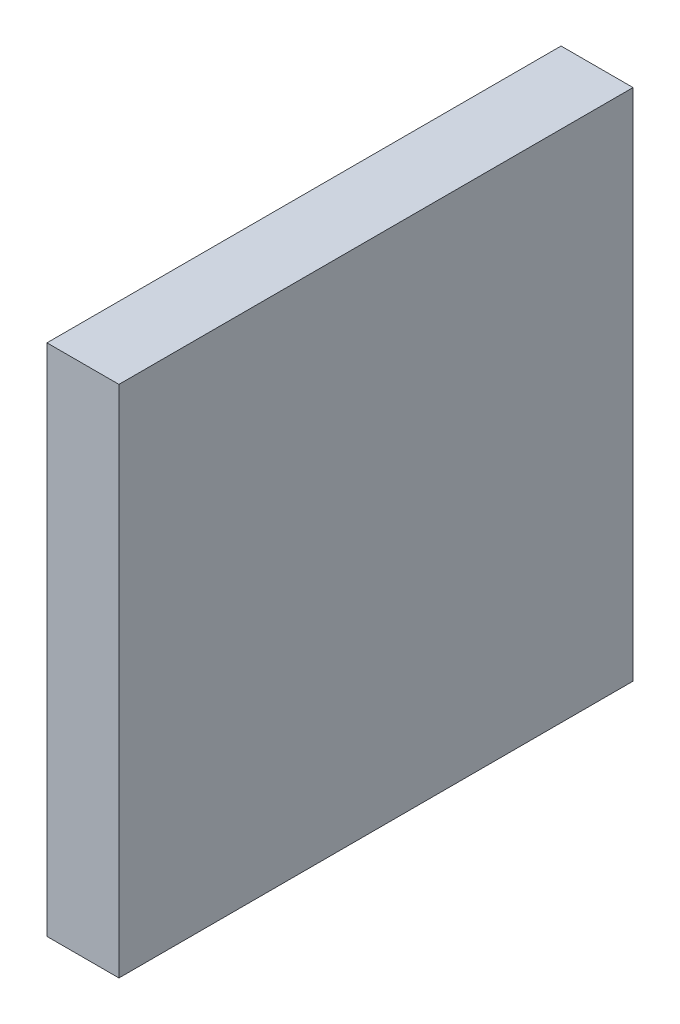
ISO-10303-21;
HEADER;
FILE_DESCRIPTION(('STEP AP214'),'2;1');
FILE_NAME('part.step','',(''),(''),'','','');
FILE_SCHEMA(('AUTOMOTIVE_DESIGN { 1 0 10303 214 1 1 1 1 }'));
ENDSEC;
DATA;
#1=APPLICATION_CONTEXT('core data for automotive mechanical design processes');
#2=APPLICATION_PROTOCOL_DEFINITION('international standard','automotive_design',2000,#1);
#3=PRODUCT_CONTEXT('',#1,'mechanical');
#4=PRODUCT('Part','Part','',(#3));
#5=PRODUCT_RELATED_PRODUCT_CATEGORY('part','',(#4));
#6=PRODUCT_DEFINITION_FORMATION('','',#4);
#7=PRODUCT_DEFINITION_CONTEXT('part definition',#1,'design');
#8=PRODUCT_DEFINITION('design','',#6,#7);
#9=PRODUCT_DEFINITION_SHAPE('','',#8);
#10=(LENGTH_UNIT() NAMED_UNIT(*) SI_UNIT(.MILLI.,.METRE.));
#11=(NAMED_UNIT(*) PLANE_ANGLE_UNIT() SI_UNIT($,.RADIAN.));
#12=(NAMED_UNIT(*) SI_UNIT($,.STERADIAN.) SOLID_ANGLE_UNIT());
#13=UNCERTAINTY_MEASURE_WITH_UNIT(LENGTH_MEASURE(1.E-05),#10,'distance_accuracy_value','');
#14=(GEOMETRIC_REPRESENTATION_CONTEXT(3) GLOBAL_UNCERTAINTY_ASSIGNED_CONTEXT((#13)) GLOBAL_UNIT_ASSIGNED_CONTEXT((#10,
#11,#12)) REPRESENTATION_CONTEXT('',''));
#15=CARTESIAN_POINT('',(0.,0.,0.));
#16=DIRECTION('',(0.,0.,1.));
#17=DIRECTION('',(1.,0.,0.));
#18=AXIS2_PLACEMENT_3D('',#15,#16,#17);
#19=CARTESIAN_POINT('',(32.,50.,200.));
#20=DIRECTION('',(1.,0.,0.));
#21=DIRECTION('',(0.,0.,-1.));
#22=AXIS2_PLACEMENT_3D('',#19,#20,#21);
#23=PLANE('',#22);
#24=DIRECTION('',(0.,-1.,0.));
#25=VECTOR('',#24,1.);
#26=CARTESIAN_POINT('',(32.,50.,100.));
#27=LINE('',#26,#25);
#28=CARTESIAN_POINT('',(32.,50.,100.));
#29=VERTEX_POINT('',#28);
#30=CARTESIAN_POINT('',(32.,-50.,100.));
#31=VERTEX_POINT('',#30);
#32=EDGE_CURVE('E105',#29,#31,#27,.T.);
#33=ORIENTED_EDGE('',*,*,#32,.T.);
#34=DIRECTION('',(0.,0.,-1.));
#35=VECTOR('',#34,1.);
#36=CARTESIAN_POINT('',(32.,-50.,200.));
#37=LINE('',#36,#35);
#38=CARTESIAN_POINT('',(32.,-50.,200.));
#39=VERTEX_POINT('',#38);
#40=EDGE_CURVE('E11',#39,#31,#37,.T.);
#41=ORIENTED_EDGE('',*,*,#40,.F.);
#42=DIRECTION('',(0.,-1.,0.));
#43=VECTOR('',#42,1.);
#44=CARTESIAN_POINT('',(32.,50.,200.));
#45=LINE('',#44,#43);
#46=CARTESIAN_POINT('',(32.,50.,200.));
#47=VERTEX_POINT('',#46);
#48=EDGE_CURVE('E89',#47,#39,#45,.T.);
#49=ORIENTED_EDGE('',*,*,#48,.F.);
#50=DIRECTION('',(0.,0.,-1.));
#51=VECTOR('',#50,1.);
#52=CARTESIAN_POINT('',(32.,50.,200.));
#53=LINE('',#52,#51);
#54=EDGE_CURVE('E97',#47,#29,#53,.T.);
#55=ORIENTED_EDGE('',*,*,#54,.T.);
#56=EDGE_LOOP('',(#33,#41,#49,#55));
#57=FACE_BOUND('',#56,.T.);
#58=ADVANCED_FACE('F39',(#57),#23,.F.);
#59=CARTESIAN_POINT('',(32.,-50.,200.));
#60=DIRECTION('',(0.,1.,0.));
#61=DIRECTION('',(0.,0.,1.));
#62=AXIS2_PLACEMENT_3D('',#59,#60,#61);
#63=PLANE('',#62);
#64=DIRECTION('',(1.,0.,0.));
#65=VECTOR('',#64,1.);
#66=CARTESIAN_POINT('',(32.,-50.,100.));
#67=LINE('',#66,#65);
#68=CARTESIAN_POINT('',(46.,-50.,100.));
#69=VERTEX_POINT('',#68);
#70=EDGE_CURVE('E92',#31,#69,#67,.T.);
#71=ORIENTED_EDGE('',*,*,#70,.T.);
#72=DIRECTION('',(0.,0.,-1.));
#73=VECTOR('',#72,1.);
#74=CARTESIAN_POINT('',(46.,-50.,200.));
#75=LINE('',#74,#73);
#76=CARTESIAN_POINT('',(46.,-50.,200.));
#77=VERTEX_POINT('',#76);
#78=EDGE_CURVE('E50',#77,#69,#75,.T.);
#79=ORIENTED_EDGE('',*,*,#78,.F.);
#80=DIRECTION('',(1.,0.,0.));
#81=VECTOR('',#80,1.);
#82=CARTESIAN_POINT('',(32.,-50.,200.));
#83=LINE('',#82,#81);
#84=EDGE_CURVE('E82',#39,#77,#83,.T.);
#85=ORIENTED_EDGE('',*,*,#84,.F.);
#86=ORIENTED_EDGE('',*,*,#40,.T.);
#87=EDGE_LOOP('',(#71,#79,#85,#86));
#88=FACE_BOUND('',#87,.T.);
#89=ADVANCED_FACE('F93',(#88),#63,.F.);
#90=CARTESIAN_POINT('',(46.,-50.,200.));
#91=DIRECTION('',(-1.,0.,0.));
#92=DIRECTION('',(0.,0.,1.));
#93=AXIS2_PLACEMENT_3D('',#90,#91,#92);
#94=PLANE('',#93);
#95=DIRECTION('',(0.,1.,0.));
#96=VECTOR('',#95,1.);
#97=CARTESIAN_POINT('',(46.,-50.,100.));
#98=LINE('',#97,#96);
#99=CARTESIAN_POINT('',(46.,50.,100.));
#100=VERTEX_POINT('',#99);
#101=EDGE_CURVE('E74',#69,#100,#98,.T.);
#102=ORIENTED_EDGE('',*,*,#101,.T.);
#103=DIRECTION('',(0.,0.,-1.));
#104=VECTOR('',#103,1.);
#105=CARTESIAN_POINT('',(46.,50.,200.));
#106=LINE('',#105,#104);
#107=CARTESIAN_POINT('',(46.,50.,200.));
#108=VERTEX_POINT('',#107);
#109=EDGE_CURVE('E94',#108,#100,#106,.T.);
#110=ORIENTED_EDGE('',*,*,#109,.F.);
#111=DIRECTION('',(0.,1.,0.));
#112=VECTOR('',#111,1.);
#113=CARTESIAN_POINT('',(46.,-50.,200.));
#114=LINE('',#113,#112);
#115=EDGE_CURVE('E88',#77,#108,#114,.T.);
#116=ORIENTED_EDGE('',*,*,#115,.F.);
#117=ORIENTED_EDGE('',*,*,#78,.T.);
#118=EDGE_LOOP('',(#102,#110,#116,#117));
#119=FACE_BOUND('',#118,.T.);
#120=ADVANCED_FACE('F96',(#119),#94,.F.);
#121=CARTESIAN_POINT('',(46.,50.,200.));
#122=DIRECTION('',(0.,-1.,0.));
#123=DIRECTION('',(0.,0.,-1.));
#124=AXIS2_PLACEMENT_3D('',#121,#122,#123);
#125=PLANE('',#124);
#126=DIRECTION('',(-1.,0.,0.));
#127=VECTOR('',#126,1.);
#128=CARTESIAN_POINT('',(46.,50.,100.));
#129=LINE('',#128,#127);
#130=EDGE_CURVE('E76',#100,#29,#129,.T.);
#131=ORIENTED_EDGE('',*,*,#130,.T.);
#132=ORIENTED_EDGE('',*,*,#54,.F.);
#133=DIRECTION('',(-1.,0.,0.));
#134=VECTOR('',#133,1.);
#135=CARTESIAN_POINT('',(46.,50.,200.));
#136=LINE('',#135,#134);
#137=EDGE_CURVE('E54',#108,#47,#136,.T.);
#138=ORIENTED_EDGE('',*,*,#137,.F.);
#139=ORIENTED_EDGE('',*,*,#109,.T.);
#140=EDGE_LOOP('',(#131,#132,#138,#139));
#141=FACE_BOUND('',#140,.T.);
#142=ADVANCED_FACE('F106',(#141),#125,.F.);
#143=CARTESIAN_POINT('',(0.,0.,200.));
#144=DIRECTION('',(0.,0.,1.));
#145=DIRECTION('',(1.,0.,0.));
#146=AXIS2_PLACEMENT_3D('',#143,#144,#145);
#147=PLANE('',#146);
#148=ORIENTED_EDGE('',*,*,#48,.T.);
#149=ORIENTED_EDGE('',*,*,#84,.T.);
#150=ORIENTED_EDGE('',*,*,#115,.T.);
#151=ORIENTED_EDGE('',*,*,#137,.T.);
#152=EDGE_LOOP('',(#148,#149,#150,#151));
#153=FACE_BOUND('',#152,.T.);
#154=ADVANCED_FACE('F86',(#153),#147,.T.);
#155=CARTESIAN_POINT('',(0.,0.,100.));
#156=DIRECTION('',(0.,0.,1.));
#157=DIRECTION('',(1.,0.,0.));
#158=AXIS2_PLACEMENT_3D('',#155,#156,#157);
#159=PLANE('',#158);
#160=ORIENTED_EDGE('',*,*,#32,.F.);
#161=ORIENTED_EDGE('',*,*,#130,.F.);
#162=ORIENTED_EDGE('',*,*,#101,.F.);
#163=ORIENTED_EDGE('',*,*,#70,.F.);
#164=EDGE_LOOP('',(#160,#161,#162,#163));
#165=FACE_BOUND('',#164,.T.);
#166=ADVANCED_FACE('F115',(#165),#159,.F.);
#167=CLOSED_SHELL('',(#58,#89,#120,#142,#154,#166));
#168=MANIFOLD_SOLID_BREP('B2',#167);
#169=ADVANCED_BREP_SHAPE_REPRESENTATION('',(#18,#168),#14);
#170=SHAPE_DEFINITION_REPRESENTATION(#9,#169);
ENDSEC;
END-ISO-10303-21;
